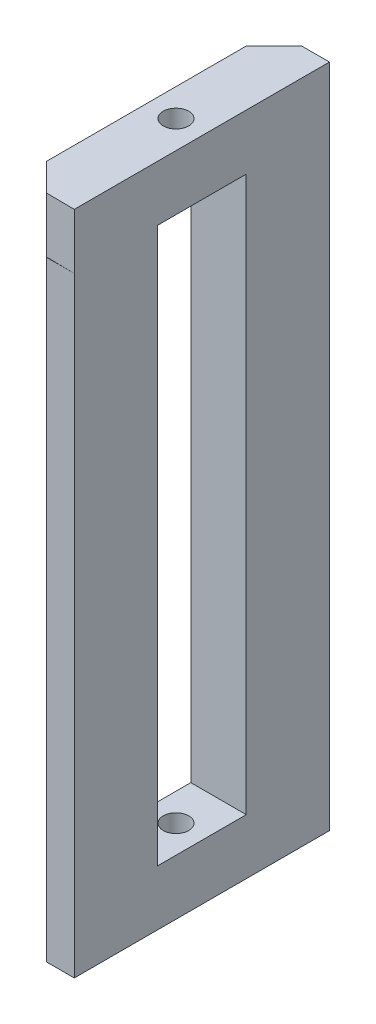
ISO-10303-21;
HEADER;
FILE_DESCRIPTION(('STEP AP214'),'2;1');
FILE_NAME('part.step','',(''),(''),'','','');
FILE_SCHEMA(('AUTOMOTIVE_DESIGN { 1 0 10303 214 1 1 1 1 }'));
ENDSEC;
DATA;
#1=APPLICATION_CONTEXT('core data for automotive mechanical design processes');
#2=APPLICATION_PROTOCOL_DEFINITION('international standard','automotive_design',2000,#1);
#3=PRODUCT_CONTEXT('',#1,'mechanical');
#4=PRODUCT('Part','Part','',(#3));
#5=PRODUCT_RELATED_PRODUCT_CATEGORY('part','',(#4));
#6=PRODUCT_DEFINITION_FORMATION('','',#4);
#7=PRODUCT_DEFINITION_CONTEXT('part definition',#1,'design');
#8=PRODUCT_DEFINITION('design','',#6,#7);
#9=PRODUCT_DEFINITION_SHAPE('','',#8);
#10=(LENGTH_UNIT() NAMED_UNIT(*) SI_UNIT(.MILLI.,.METRE.));
#11=(NAMED_UNIT(*) PLANE_ANGLE_UNIT() SI_UNIT($,.RADIAN.));
#12=(NAMED_UNIT(*) SI_UNIT($,.STERADIAN.) SOLID_ANGLE_UNIT());
#13=UNCERTAINTY_MEASURE_WITH_UNIT(LENGTH_MEASURE(1.E-05),#10,'distance_accuracy_value','');
#14=(GEOMETRIC_REPRESENTATION_CONTEXT(3) GLOBAL_UNCERTAINTY_ASSIGNED_CONTEXT((#13)) GLOBAL_UNIT_ASSIGNED_CONTEXT((#10,
#11,#12)) REPRESENTATION_CONTEXT('',''));
#15=CARTESIAN_POINT('',(0.,0.,0.));
#16=DIRECTION('',(0.,0.,1.));
#17=DIRECTION('',(1.,0.,0.));
#18=AXIS2_PLACEMENT_3D('',#15,#16,#17);
#19=CARTESIAN_POINT('',(-1.39441777162774E-12,226.195974268059,0.));
#20=DIRECTION('',(0.,1.,0.));
#21=DIRECTION('',(-1.,0.,0.));
#22=AXIS2_PLACEMENT_3D('',#19,#20,#21);
#23=PLANE('',#22);
#24=DIRECTION('',(-1.,0.,0.));
#25=VECTOR('',#24,1.);
#26=CARTESIAN_POINT('',(1.55898069389324,226.195974268059,66.5231298363773));
#27=LINE('',#26,#25);
#28=CARTESIAN_POINT('',(1.55898069389324,226.195974268059,66.5231298363773));
#29=VERTEX_POINT('',#28);
#30=CARTESIAN_POINT('',(-3.44101930610671,226.195974268059,66.5231298363773));
#31=VERTEX_POINT('',#30);
#32=EDGE_CURVE('E185',#29,#31,#27,.T.);
#33=ORIENTED_EDGE('',*,*,#32,.T.);
#34=DIRECTION('',(0.707106781186548,0.,-0.707106781186548));
#35=VECTOR('',#34,1.);
#36=CARTESIAN_POINT('',(31.5410552651346,226.195974268059,31.541055265136));
#37=LINE('',#36,#35);
#38=CARTESIAN_POINT('',(-3.45141934899058,226.195974268059,66.5335298792611));
#39=VERTEX_POINT('',#38);
#40=EDGE_CURVE('E232',#31,#39,#37,.F.);
#41=ORIENTED_EDGE('',*,*,#40,.T.);
#42=DIRECTION('',(-0.999997845760145,0.,0.00207568664990131));
#43=VECTOR('',#42,1.);
#44=CARTESIAN_POINT('',(1.55898069389324,226.195974268059,66.5231298363773));
#45=LINE('',#44,#43);
#46=EDGE_CURVE('E156',#29,#39,#45,.T.);
#47=ORIENTED_EDGE('',*,*,#46,.F.);
#48=EDGE_LOOP('',(#33,#41,#47));
#49=FACE_BOUND('',#48,.T.);
#50=ADVANCED_FACE('F33',(#49),#23,.T.);
#51=CARTESIAN_POINT('',(-1.39441777162774E-12,226.195974268059,0.));
#52=DIRECTION('',(0.,-1.,0.));
#53=DIRECTION('',(1.,0.,0.));
#54=AXIS2_PLACEMENT_3D('',#51,#52,#53);
#55=PLANE('',#54);
#56=DIRECTION('',(0.999952332528484,0.,0.00976384508501706));
#57=VECTOR('',#56,1.);
#58=CARTESIAN_POINT('',(-8.44101930610674,226.195974268059,112.425486731127));
#59=LINE('',#58,#57);
#60=CARTESIAN_POINT('',(-3.49032226816308,226.195974268059,112.473826874321));
#61=VERTEX_POINT('',#60);
#62=CARTESIAN_POINT('',(1.55898069389324,226.195974268059,112.523129836377));
#63=VERTEX_POINT('',#62);
#64=EDGE_CURVE('E141',#61,#63,#59,.T.);
#65=ORIENTED_EDGE('',*,*,#64,.F.);
#66=DIRECTION('',(-0.707106781186547,0.,-0.707106781186549));
#67=VECTOR('',#66,1.);
#68=CARTESIAN_POINT('',(-3.44101930610665,226.195974268059,112.523129836377));
#69=LINE('',#68,#67);
#70=CARTESIAN_POINT('',(-3.44101930610671,226.195974268059,112.523129836377));
#71=VERTEX_POINT('',#70);
#72=EDGE_CURVE('E11',#61,#71,#69,.F.);
#73=ORIENTED_EDGE('',*,*,#72,.T.);
#74=DIRECTION('',(1.,0.,0.));
#75=VECTOR('',#74,1.);
#76=CARTESIAN_POINT('',(1.55898069389324,226.195974268059,112.523129836377));
#77=LINE('',#76,#75);
#78=EDGE_CURVE('E168',#71,#63,#77,.T.);
#79=ORIENTED_EDGE('',*,*,#78,.T.);
#80=EDGE_LOOP('',(#65,#73,#79));
#81=FACE_BOUND('',#80,.T.);
#82=ADVANCED_FACE('F290',(#81),#55,.F.);
#83=CARTESIAN_POINT('',(-8.74087508754403E-13,126.195974268059,0.));
#84=DIRECTION('',(0.,1.,0.));
#85=DIRECTION('',(-1.,0.,0.));
#86=AXIS2_PLACEMENT_3D('',#83,#84,#85);
#87=PLANE('',#86);
#88=CARTESIAN_POINT('',(-3.44101930610605,126.195974268059,89.1878173326564));
#89=DIRECTION('',(0.,1.,0.));
#90=DIRECTION('',(-1.,0.,0.));
#91=AXIS2_PLACEMENT_3D('',#88,#89,#90);
#92=CIRCLE('',#91,2.29999999999999);
#93=CARTESIAN_POINT('',(-5.74101930610605,126.195974268059,89.1878173326564));
#94=VERTEX_POINT('',#93);
#95=EDGE_CURVE('E197',#94,#94,#92,.T.);
#96=ORIENTED_EDGE('',*,*,#95,.F.);
#97=EDGE_LOOP('',(#96));
#98=FACE_BOUND('',#97,.T.);
#99=DIRECTION('',(0.,0.,1.));
#100=VECTOR('',#99,1.);
#101=CARTESIAN_POINT('',(-8.44101930610605,126.195974268059,81.5231298363773));
#102=LINE('',#101,#100);
#103=CARTESIAN_POINT('',(-8.44101930610605,126.195974268059,81.5231298363773));
#104=VERTEX_POINT('',#103);
#105=CARTESIAN_POINT('',(-8.44101930610605,126.195974268059,97.5231298363773));
#106=VERTEX_POINT('',#105);
#107=EDGE_CURVE('E203',#104,#106,#102,.T.);
#108=ORIENTED_EDGE('',*,*,#107,.T.);
#109=DIRECTION('',(-1.,0.,0.));
#110=VECTOR('',#109,1.);
#111=CARTESIAN_POINT('',(-8.44101930610605,126.195974268059,97.5231298363773));
#112=LINE('',#111,#110);
#113=CARTESIAN_POINT('',(1.55898069389394,126.195974268059,97.5231298363773));
#114=VERTEX_POINT('',#113);
#115=EDGE_CURVE('E144',#114,#106,#112,.T.);
#116=ORIENTED_EDGE('',*,*,#115,.F.);
#117=DIRECTION('',(0.,0.,-1.));
#118=VECTOR('',#117,1.);
#119=CARTESIAN_POINT('',(1.55898069389394,126.195974268059,112.523129836377));
#120=LINE('',#119,#118);
#121=CARTESIAN_POINT('',(1.55898069389395,126.195974268059,81.5231298363773));
#122=VERTEX_POINT('',#121);
#123=EDGE_CURVE('E205',#114,#122,#120,.T.);
#124=ORIENTED_EDGE('',*,*,#123,.T.);
#125=DIRECTION('',(1.,0.,0.));
#126=VECTOR('',#125,1.);
#127=CARTESIAN_POINT('',(-8.44101930610605,126.195974268059,81.5231298363773));
#128=LINE('',#127,#126);
#129=EDGE_CURVE('E181',#104,#122,#128,.T.);
#130=ORIENTED_EDGE('',*,*,#129,.F.);
#131=EDGE_LOOP('',(#108,#116,#124,#130));
#132=FACE_BOUND('',#131,.T.);
#133=ADVANCED_FACE('F295',(#98,#132),#87,.T.);
#134=CARTESIAN_POINT('',(-8.06271537507196E-13,116.195974268059,0.));
#135=DIRECTION('',(0.,1.,0.));
#136=DIRECTION('',(-1.,0.,0.));
#137=AXIS2_PLACEMENT_3D('',#134,#135,#136);
#138=PLANE('',#137);
#139=DIRECTION('',(0.,0.,1.));
#140=VECTOR('',#139,1.);
#141=CARTESIAN_POINT('',(-8.44101930610599,116.195974268059,97.5231298363773));
#142=LINE('',#141,#140);
#143=CARTESIAN_POINT('',(-8.44101930610599,116.195974268059,71.5231298363773));
#144=VERTEX_POINT('',#143);
#145=CARTESIAN_POINT('',(-8.44101930610598,116.195974268059,107.523129836377));
#146=VERTEX_POINT('',#145);
#147=EDGE_CURVE('E200',#144,#146,#142,.T.);
#148=ORIENTED_EDGE('',*,*,#147,.F.);
#149=DIRECTION('',(-0.707106781186548,0.,0.707106781186548));
#150=VECTOR('',#149,1.);
#151=CARTESIAN_POINT('',(-8.44101930610599,116.195974268059,71.5231298363773));
#152=LINE('',#151,#150);
#153=CARTESIAN_POINT('',(-3.44101930610597,116.195974268059,66.5231298363773));
#154=VERTEX_POINT('',#153);
#155=EDGE_CURVE('E228',#144,#154,#152,.F.);
#156=ORIENTED_EDGE('',*,*,#155,.T.);
#157=DIRECTION('',(-1.,0.,0.));
#158=VECTOR('',#157,1.);
#159=CARTESIAN_POINT('',(1.55898069389401,116.195974268059,66.5231298363773));
#160=LINE('',#159,#158);
#161=CARTESIAN_POINT('',(1.55898069389401,116.195974268059,66.5231298363773));
#162=VERTEX_POINT('',#161);
#163=EDGE_CURVE('E206',#162,#154,#160,.T.);
#164=ORIENTED_EDGE('',*,*,#163,.F.);
#165=DIRECTION('',(0.,0.,-1.));
#166=VECTOR('',#165,1.);
#167=CARTESIAN_POINT('',(1.55898069389401,116.195974268059,112.523129836377));
#168=LINE('',#167,#166);
#169=CARTESIAN_POINT('',(1.55898069389401,116.195974268059,112.523129836377));
#170=VERTEX_POINT('',#169);
#171=EDGE_CURVE('E213',#170,#162,#168,.T.);
#172=ORIENTED_EDGE('',*,*,#171,.F.);
#173=DIRECTION('',(1.,0.,0.));
#174=VECTOR('',#173,1.);
#175=CARTESIAN_POINT('',(-8.44101930610598,116.195974268059,112.523129836377));
#176=LINE('',#175,#174);
#177=CARTESIAN_POINT('',(-3.44101930610597,116.195974268059,112.523129836377));
#178=VERTEX_POINT('',#177);
#179=EDGE_CURVE('E211',#178,#170,#176,.T.);
#180=ORIENTED_EDGE('',*,*,#179,.F.);
#181=DIRECTION('',(0.707106781186547,0.,0.707106781186549));
#182=VECTOR('',#181,1.);
#183=CARTESIAN_POINT('',(-3.44101930610596,116.195974268059,112.523129836377));
#184=LINE('',#183,#182);
#185=EDGE_CURVE('E226',#178,#146,#184,.F.);
#186=ORIENTED_EDGE('',*,*,#185,.T.);
#187=EDGE_LOOP('',(#148,#156,#164,#172,#180,#186));
#188=FACE_BOUND('',#187,.T.);
#189=CARTESIAN_POINT('',(-3.44101930610599,116.195974268059,89.1878173326564));
#190=DIRECTION('',(0.,1.,0.));
#191=DIRECTION('',(-1.,0.,0.));
#192=AXIS2_PLACEMENT_3D('',#189,#190,#191);
#193=CIRCLE('',#192,2.29999999999999);
#194=CARTESIAN_POINT('',(-5.74101930610598,116.195974268059,89.1878173326564));
#195=VERTEX_POINT('',#194);
#196=EDGE_CURVE('E196',#195,#195,#193,.T.);
#197=ORIENTED_EDGE('',*,*,#196,.T.);
#198=EDGE_LOOP('',(#197));
#199=FACE_BOUND('',#198,.T.);
#200=ADVANCED_FACE('F250',(#188,#199),#138,.F.);
#201=CARTESIAN_POINT('',(-8.44101930610605,126.195974268059,97.5231298363773));
#202=DIRECTION('',(1.,0.,0.));
#203=DIRECTION('',(0.,1.,0.));
#204=AXIS2_PLACEMENT_3D('',#201,#202,#203);
#205=PLANE('',#204);
#206=DIRECTION('',(0.,-1.,0.));
#207=VECTOR('',#206,1.);
#208=CARTESIAN_POINT('',(-8.44101930610674,226.195974268059,81.5231298363773));
#209=LINE('',#208,#207);
#210=CARTESIAN_POINT('',(-8.44101930610674,226.195974268059,81.5231298363773));
#211=VERTEX_POINT('',#210);
#212=EDGE_CURVE('E193',#211,#104,#209,.T.);
#213=ORIENTED_EDGE('',*,*,#212,.F.);
#214=DIRECTION('',(0.,0.,1.));
#215=VECTOR('',#214,1.);
#216=CARTESIAN_POINT('',(-8.44101930610674,226.195974268059,66.5438867475916));
#217=LINE('',#216,#215);
#218=CARTESIAN_POINT('',(-8.44101930610674,226.195974268059,97.5231298363773));
#219=VERTEX_POINT('',#218);
#220=EDGE_CURVE('E159',#211,#219,#217,.T.);
#221=ORIENTED_EDGE('',*,*,#220,.T.);
#222=DIRECTION('',(0.,-1.,0.));
#223=VECTOR('',#222,1.);
#224=CARTESIAN_POINT('',(-8.44101930610674,226.195974268059,97.5231298363773));
#225=LINE('',#224,#223);
#226=EDGE_CURVE('E173',#219,#106,#225,.T.);
#227=ORIENTED_EDGE('',*,*,#226,.T.);
#228=ORIENTED_EDGE('',*,*,#107,.F.);
#229=EDGE_LOOP('',(#213,#221,#227,#228));
#230=FACE_BOUND('',#229,.T.);
#231=DIRECTION('',(0.,0.,1.));
#232=VECTOR('',#231,1.);
#233=CARTESIAN_POINT('',(-8.4410193061068,236.195974268059,66.5438867475916));
#234=LINE('',#233,#232);
#235=CARTESIAN_POINT('',(-8.4410193061068,236.195974268059,71.5231298363773));
#236=VERTEX_POINT('',#235);
#237=CARTESIAN_POINT('',(-8.4410193061068,236.195974268059,107.523129836377));
#238=VERTEX_POINT('',#237);
#239=EDGE_CURVE('E136',#236,#238,#234,.T.);
#240=ORIENTED_EDGE('',*,*,#239,.F.);
#241=DIRECTION('',(0.,-1.,0.));
#242=VECTOR('',#241,1.);
#243=CARTESIAN_POINT('',(-8.44101930610606,126.195974268059,71.5231298363773));
#244=LINE('',#243,#242);
#245=EDGE_CURVE('E223',#236,#144,#244,.T.);
#246=ORIENTED_EDGE('',*,*,#245,.T.);
#247=ORIENTED_EDGE('',*,*,#147,.T.);
#248=DIRECTION('',(0.,1.,0.));
#249=VECTOR('',#248,1.);
#250=CARTESIAN_POINT('',(-8.44101930610605,126.195974268059,107.523129836377));
#251=LINE('',#250,#249);
#252=EDGE_CURVE('E221',#146,#238,#251,.T.);
#253=ORIENTED_EDGE('',*,*,#252,.T.);
#254=EDGE_LOOP('',(#240,#246,#247,#253));
#255=FACE_BOUND('',#254,.T.);
#256=ADVANCED_FACE('F312',(#230,#255),#205,.F.);
#257=CARTESIAN_POINT('',(-8.44101930610605,126.195974268059,112.523129836377));
#258=DIRECTION('',(0.,0.,-1.));
#259=DIRECTION('',(-1.,0.,0.));
#260=AXIS2_PLACEMENT_3D('',#257,#258,#259);
#261=PLANE('',#260);
#262=ORIENTED_EDGE('',*,*,#78,.F.);
#263=DIRECTION('',(0.,-1.,0.));
#264=VECTOR('',#263,1.);
#265=CARTESIAN_POINT('',(-3.44101930610603,126.195974268059,112.523129836377));
#266=LINE('',#265,#264);
#267=EDGE_CURVE('E239',#71,#178,#266,.T.);
#268=ORIENTED_EDGE('',*,*,#267,.T.);
#269=ORIENTED_EDGE('',*,*,#179,.T.);
#270=DIRECTION('',(0.,-1.,0.));
#271=VECTOR('',#270,1.);
#272=CARTESIAN_POINT('',(1.55898069389394,126.195974268059,112.523129836377));
#273=LINE('',#272,#271);
#274=EDGE_CURVE('E219',#63,#170,#273,.T.);
#275=ORIENTED_EDGE('',*,*,#274,.F.);
#276=EDGE_LOOP('',(#262,#268,#269,#275));
#277=FACE_BOUND('',#276,.T.);
#278=ADVANCED_FACE('F244',(#277),#261,.F.);
#279=CARTESIAN_POINT('',(1.55898069389394,126.195974268059,112.523129836377));
#280=DIRECTION('',(-1.,0.,0.));
#281=DIRECTION('',(0.,-1.,0.));
#282=AXIS2_PLACEMENT_3D('',#279,#280,#281);
#283=PLANE('',#282);
#284=DIRECTION('',(0.,-1.,0.));
#285=VECTOR('',#284,1.);
#286=CARTESIAN_POINT('',(1.55898069389394,126.195974268059,66.5231298363773));
#287=LINE('',#286,#285);
#288=EDGE_CURVE('E208',#29,#162,#287,.T.);
#289=ORIENTED_EDGE('',*,*,#288,.F.);
#290=DIRECTION('',(0.,-1.,0.));
#291=VECTOR('',#290,1.);
#292=CARTESIAN_POINT('',(1.55898069389319,236.195974268059,66.5231298363773));
#293=LINE('',#292,#291);
#294=CARTESIAN_POINT('',(1.55898069389319,236.195974268059,66.5231298363773));
#295=VERTEX_POINT('',#294);
#296=EDGE_CURVE('E145',#295,#29,#293,.T.);
#297=ORIENTED_EDGE('',*,*,#296,.F.);
#298=DIRECTION('',(0.,0.,-1.));
#299=VECTOR('',#298,1.);
#300=CARTESIAN_POINT('',(1.55898069389319,236.195974268059,112.523129836377));
#301=LINE('',#300,#299);
#302=CARTESIAN_POINT('',(1.55898069389319,236.195974268059,112.523129836377));
#303=VERTEX_POINT('',#302);
#304=EDGE_CURVE('E131',#303,#295,#301,.T.);
#305=ORIENTED_EDGE('',*,*,#304,.F.);
#306=DIRECTION('',(0.,-1.,0.));
#307=VECTOR('',#306,1.);
#308=CARTESIAN_POINT('',(1.55898069389319,236.195974268059,112.523129836377));
#309=LINE('',#308,#307);
#310=EDGE_CURVE('E139',#303,#63,#309,.T.);
#311=ORIENTED_EDGE('',*,*,#310,.T.);
#312=ORIENTED_EDGE('',*,*,#274,.T.);
#313=ORIENTED_EDGE('',*,*,#171,.T.);
#314=EDGE_LOOP('',(#289,#297,#305,#311,#312,#313));
#315=FACE_BOUND('',#314,.T.);
#316=DIRECTION('',(0.,0.,-1.));
#317=VECTOR('',#316,1.);
#318=CARTESIAN_POINT('',(1.55898069389324,226.195974268059,112.523129836377));
#319=LINE('',#318,#317);
#320=CARTESIAN_POINT('',(1.55898069389324,226.195974268059,97.5231298363773));
#321=VERTEX_POINT('',#320);
#322=CARTESIAN_POINT('',(1.55898069389325,226.195974268059,81.5231298363773));
#323=VERTEX_POINT('',#322);
#324=EDGE_CURVE('E164',#321,#323,#319,.T.);
#325=ORIENTED_EDGE('',*,*,#324,.T.);
#326=DIRECTION('',(0.,-1.,0.));
#327=VECTOR('',#326,1.);
#328=CARTESIAN_POINT('',(1.55898069389325,226.195974268059,81.5231298363773));
#329=LINE('',#328,#327);
#330=EDGE_CURVE('E188',#323,#122,#329,.T.);
#331=ORIENTED_EDGE('',*,*,#330,.T.);
#332=ORIENTED_EDGE('',*,*,#123,.F.);
#333=DIRECTION('',(0.,-1.,0.));
#334=VECTOR('',#333,1.);
#335=CARTESIAN_POINT('',(1.55898069389325,226.195974268059,97.5231298363773));
#336=LINE('',#335,#334);
#337=EDGE_CURVE('E178',#321,#114,#336,.T.);
#338=ORIENTED_EDGE('',*,*,#337,.F.);
#339=EDGE_LOOP('',(#325,#331,#332,#338));
#340=FACE_BOUND('',#339,.T.);
#341=ADVANCED_FACE('F148',(#315,#340),#283,.F.);
#342=CARTESIAN_POINT('',(1.55898069389394,126.195974268059,66.5231298363773));
#343=DIRECTION('',(0.,0.,1.));
#344=DIRECTION('',(1.,0.,0.));
#345=AXIS2_PLACEMENT_3D('',#342,#343,#344);
#346=PLANE('',#345);
#347=ORIENTED_EDGE('',*,*,#163,.T.);
#348=DIRECTION('',(0.,1.,0.));
#349=VECTOR('',#348,1.);
#350=CARTESIAN_POINT('',(-3.44101930610604,126.195974268059,66.5231298363773));
#351=LINE('',#350,#349);
#352=EDGE_CURVE('E230',#154,#31,#351,.T.);
#353=ORIENTED_EDGE('',*,*,#352,.T.);
#354=ORIENTED_EDGE('',*,*,#32,.F.);
#355=ORIENTED_EDGE('',*,*,#288,.T.);
#356=EDGE_LOOP('',(#347,#353,#354,#355));
#357=FACE_BOUND('',#356,.T.);
#358=ADVANCED_FACE('F255',(#357),#346,.F.);
#359=CARTESIAN_POINT('',(-3.44101930610605,126.195974268059,89.1878173326564));
#360=DIRECTION('',(0.,-1.,0.));
#361=DIRECTION('',(1.,0.,0.));
#362=AXIS2_PLACEMENT_3D('',#359,#360,#361);
#363=CYLINDRICAL_SURFACE('',#362,2.29999999999999);
#364=ORIENTED_EDGE('',*,*,#95,.T.);
#365=EDGE_LOOP('',(#364));
#366=FACE_BOUND('',#365,.T.);
#367=ORIENTED_EDGE('',*,*,#196,.F.);
#368=EDGE_LOOP('',(#367));
#369=FACE_BOUND('',#368,.T.);
#370=ADVANCED_FACE('F302',(#366,#369),#363,.F.);
#371=CARTESIAN_POINT('',(-8.44101930610674,226.195974268059,81.5231298363773));
#372=DIRECTION('',(0.,0.,-1.));
#373=DIRECTION('',(0.,1.,0.));
#374=AXIS2_PLACEMENT_3D('',#371,#372,#373);
#375=PLANE('',#374);
#376=ORIENTED_EDGE('',*,*,#129,.T.);
#377=ORIENTED_EDGE('',*,*,#330,.F.);
#378=DIRECTION('',(1.,0.,0.));
#379=VECTOR('',#378,1.);
#380=CARTESIAN_POINT('',(-8.44101930610674,226.195974268059,81.5231298363773));
#381=LINE('',#380,#379);
#382=EDGE_CURVE('E182',#211,#323,#381,.T.);
#383=ORIENTED_EDGE('',*,*,#382,.F.);
#384=ORIENTED_EDGE('',*,*,#212,.T.);
#385=EDGE_LOOP('',(#376,#377,#383,#384));
#386=FACE_BOUND('',#385,.T.);
#387=ADVANCED_FACE('F299',(#386),#375,.F.);
#388=CARTESIAN_POINT('',(-8.44101930610674,226.195974268059,97.5231298363773));
#389=DIRECTION('',(0.,0.,1.));
#390=DIRECTION('',(0.,-1.,0.));
#391=AXIS2_PLACEMENT_3D('',#388,#389,#390);
#392=PLANE('',#391);
#393=ORIENTED_EDGE('',*,*,#115,.T.);
#394=ORIENTED_EDGE('',*,*,#226,.F.);
#395=DIRECTION('',(-1.,0.,0.));
#396=VECTOR('',#395,1.);
#397=CARTESIAN_POINT('',(-8.44101930610674,226.195974268059,97.5231298363773));
#398=LINE('',#397,#396);
#399=EDGE_CURVE('E170',#321,#219,#398,.T.);
#400=ORIENTED_EDGE('',*,*,#399,.F.);
#401=ORIENTED_EDGE('',*,*,#337,.T.);
#402=EDGE_LOOP('',(#393,#394,#400,#401));
#403=FACE_BOUND('',#402,.T.);
#404=ADVANCED_FACE('F285',(#403),#392,.F.);
#405=CARTESIAN_POINT('',(-1.25563989354959E-12,226.195974268059,0.));
#406=DIRECTION('',(0.,1.,0.));
#407=DIRECTION('',(-1.,0.,0.));
#408=AXIS2_PLACEMENT_3D('',#405,#406,#407);
#409=PLANE('',#408);
#410=CARTESIAN_POINT('',(-3.44101930610661,226.195974268059,89.1878173326564));
#411=DIRECTION('',(0.,1.,0.));
#412=DIRECTION('',(-1.,0.,0.));
#413=AXIS2_PLACEMENT_3D('',#410,#411,#412);
#414=CIRCLE('',#413,2.29999999999999);
#415=CARTESIAN_POINT('',(-5.7410193061066,226.195974268059,89.1878173326564));
#416=VERTEX_POINT('',#415);
#417=EDGE_CURVE('E269',#416,#416,#414,.T.);
#418=ORIENTED_EDGE('',*,*,#417,.T.);
#419=EDGE_LOOP('',(#418));
#420=FACE_BOUND('',#419,.T.);
#421=ORIENTED_EDGE('',*,*,#220,.F.);
#422=ORIENTED_EDGE('',*,*,#382,.T.);
#423=ORIENTED_EDGE('',*,*,#324,.F.);
#424=ORIENTED_EDGE('',*,*,#399,.T.);
#425=EDGE_LOOP('',(#421,#422,#423,#424));
#426=FACE_BOUND('',#425,.T.);
#427=ADVANCED_FACE('F278',(#420,#426),#409,.F.);
#428=CARTESIAN_POINT('',(-1.31115104478085E-12,236.195974268059,0.));
#429=DIRECTION('',(0.,1.,0.));
#430=DIRECTION('',(-1.,0.,0.));
#431=AXIS2_PLACEMENT_3D('',#428,#429,#430);
#432=PLANE('',#431);
#433=DIRECTION('',(-0.999997845760145,0.,0.00207568664990131));
#434=VECTOR('',#433,1.);
#435=CARTESIAN_POINT('',(1.55898069389319,236.195974268059,66.5231298363773));
#436=LINE('',#435,#434);
#437=CARTESIAN_POINT('',(-3.45141934899065,236.195974268059,66.5335298792611));
#438=VERTEX_POINT('',#437);
#439=EDGE_CURVE('E166',#295,#438,#436,.T.);
#440=ORIENTED_EDGE('',*,*,#439,.T.);
#441=DIRECTION('',(0.707106781186548,0.,-0.707106781186548));
#442=VECTOR('',#441,1.);
#443=CARTESIAN_POINT('',(31.5410552651346,236.195974268059,31.5410552651359));
#444=LINE('',#443,#442);
#445=EDGE_CURVE('E237',#438,#236,#444,.F.);
#446=ORIENTED_EDGE('',*,*,#445,.T.);
#447=ORIENTED_EDGE('',*,*,#239,.T.);
#448=DIRECTION('',(-0.707106781186547,0.,-0.707106781186549));
#449=VECTOR('',#448,1.);
#450=CARTESIAN_POINT('',(-57.9820745712427,236.195974268059,57.9820745712412));
#451=LINE('',#450,#449);
#452=CARTESIAN_POINT('',(-3.49032226816315,236.195974268059,112.473826874321));
#453=VERTEX_POINT('',#452);
#454=EDGE_CURVE('E135',#238,#453,#451,.F.);
#455=ORIENTED_EDGE('',*,*,#454,.T.);
#456=DIRECTION('',(0.999952332528484,0.,0.00976384508501706));
#457=VECTOR('',#456,1.);
#458=CARTESIAN_POINT('',(-8.4410193061068,236.195974268059,112.425486731127));
#459=LINE('',#458,#457);
#460=EDGE_CURVE('E125',#453,#303,#459,.T.);
#461=ORIENTED_EDGE('',*,*,#460,.T.);
#462=ORIENTED_EDGE('',*,*,#304,.T.);
#463=EDGE_LOOP('',(#440,#446,#447,#455,#461,#462));
#464=FACE_BOUND('',#463,.T.);
#465=CARTESIAN_POINT('',(-3.44101930610666,236.195974268059,89.1878173326564));
#466=DIRECTION('',(0.,1.,0.));
#467=DIRECTION('',(-1.,0.,0.));
#468=AXIS2_PLACEMENT_3D('',#465,#466,#467);
#469=CIRCLE('',#468,2.29999999999999);
#470=CARTESIAN_POINT('',(-5.74101930610665,236.195974268059,89.1878173326564));
#471=VERTEX_POINT('',#470);
#472=EDGE_CURVE('E160',#471,#471,#469,.T.);
#473=ORIENTED_EDGE('',*,*,#472,.F.);
#474=EDGE_LOOP('',(#473));
#475=FACE_BOUND('',#474,.T.);
#476=ADVANCED_FACE('F128',(#464,#475),#432,.T.);
#477=CARTESIAN_POINT('',(1.55898069389319,236.195974268059,66.5231298363773));
#478=DIRECTION('',(0.00207568664990131,0.,0.999997845760145));
#479=DIRECTION('',(0.999997845760145,0.,-0.00207568664990131));
#480=AXIS2_PLACEMENT_3D('',#477,#478,#479);
#481=PLANE('',#480);
#482=ORIENTED_EDGE('',*,*,#46,.T.);
#483=DIRECTION('',(0.,-1.,0.));
#484=VECTOR('',#483,1.);
#485=CARTESIAN_POINT('',(-3.4514193489899,126.195974268059,66.5335298792611));
#486=LINE('',#485,#484);
#487=EDGE_CURVE('E234',#39,#438,#486,.F.);
#488=ORIENTED_EDGE('',*,*,#487,.T.);
#489=ORIENTED_EDGE('',*,*,#439,.F.);
#490=ORIENTED_EDGE('',*,*,#296,.T.);
#491=EDGE_LOOP('',(#482,#488,#489,#490));
#492=FACE_BOUND('',#491,.T.);
#493=ADVANCED_FACE('F265',(#492),#481,.F.);
#494=CARTESIAN_POINT('',(-8.4410193061068,236.195974268059,112.425486731127));
#495=DIRECTION('',(0.00976384508501706,0.,-0.999952332528484));
#496=DIRECTION('',(-0.999952332528484,0.,-0.00976384508501706));
#497=AXIS2_PLACEMENT_3D('',#494,#495,#496);
#498=PLANE('',#497);
#499=ORIENTED_EDGE('',*,*,#460,.F.);
#500=DIRECTION('',(0.,1.,0.));
#501=VECTOR('',#500,1.);
#502=CARTESIAN_POINT('',(-3.49032226816241,126.195974268059,112.473826874321));
#503=LINE('',#502,#501);
#504=EDGE_CURVE('E41',#453,#61,#503,.F.);
#505=ORIENTED_EDGE('',*,*,#504,.T.);
#506=ORIENTED_EDGE('',*,*,#64,.T.);
#507=ORIENTED_EDGE('',*,*,#310,.F.);
#508=EDGE_LOOP('',(#499,#505,#506,#507));
#509=FACE_BOUND('',#508,.T.);
#510=ADVANCED_FACE('F140',(#509),#498,.F.);
#511=CARTESIAN_POINT('',(-3.44101930610666,236.195974268059,89.1878173326564));
#512=DIRECTION('',(0.,-1.,0.));
#513=DIRECTION('',(1.,0.,0.));
#514=AXIS2_PLACEMENT_3D('',#511,#512,#513);
#515=CYLINDRICAL_SURFACE('',#514,2.29999999999999);
#516=ORIENTED_EDGE('',*,*,#472,.T.);
#517=EDGE_LOOP('',(#516));
#518=FACE_BOUND('',#517,.T.);
#519=ORIENTED_EDGE('',*,*,#417,.F.);
#520=EDGE_LOOP('',(#519));
#521=FACE_BOUND('',#520,.T.);
#522=ADVANCED_FACE('F275',(#518,#521),#515,.F.);
#523=CARTESIAN_POINT('',(-8.44101930610606,126.195974268059,71.5231298363773));
#524=DIRECTION('',(0.707106781186547,0.,0.707106781186547));
#525=DIRECTION('',(0.,-1.,0.));
#526=AXIS2_PLACEMENT_3D('',#523,#524,#525);
#527=PLANE('',#526);
#528=ORIENTED_EDGE('',*,*,#40,.F.);
#529=ORIENTED_EDGE('',*,*,#352,.F.);
#530=ORIENTED_EDGE('',*,*,#155,.F.);
#531=ORIENTED_EDGE('',*,*,#245,.F.);
#532=ORIENTED_EDGE('',*,*,#445,.F.);
#533=ORIENTED_EDGE('',*,*,#487,.F.);
#534=EDGE_LOOP('',(#528,#529,#530,#531,#532,#533));
#535=FACE_BOUND('',#534,.T.);
#536=ADVANCED_FACE('F261',(#535),#527,.F.);
#537=CARTESIAN_POINT('',(-3.44101930610603,126.195974268059,112.523129836377));
#538=DIRECTION('',(0.707106781186548,0.,-0.707106781186546));
#539=DIRECTION('',(0.,-1.,0.));
#540=AXIS2_PLACEMENT_3D('',#537,#538,#539);
#541=PLANE('',#540);
#542=ORIENTED_EDGE('',*,*,#454,.F.);
#543=ORIENTED_EDGE('',*,*,#252,.F.);
#544=ORIENTED_EDGE('',*,*,#185,.F.);
#545=ORIENTED_EDGE('',*,*,#267,.F.);
#546=ORIENTED_EDGE('',*,*,#72,.F.);
#547=ORIENTED_EDGE('',*,*,#504,.F.);
#548=EDGE_LOOP('',(#542,#543,#544,#545,#546,#547));
#549=FACE_BOUND('',#548,.T.);
#550=ADVANCED_FACE('F35',(#549),#541,.F.);
#551=CLOSED_SHELL('',(#50,#82,#133,#200,#256,#278,#341,#358,#370,#387,#404,#427,#476,#493,#510,
#522,#536,#550));
#552=MANIFOLD_SOLID_BREP('B2',#551);
#553=ADVANCED_BREP_SHAPE_REPRESENTATION('',(#18,#552),#14);
#554=SHAPE_DEFINITION_REPRESENTATION(#9,#553);
ENDSEC;
END-ISO-10303-21;
